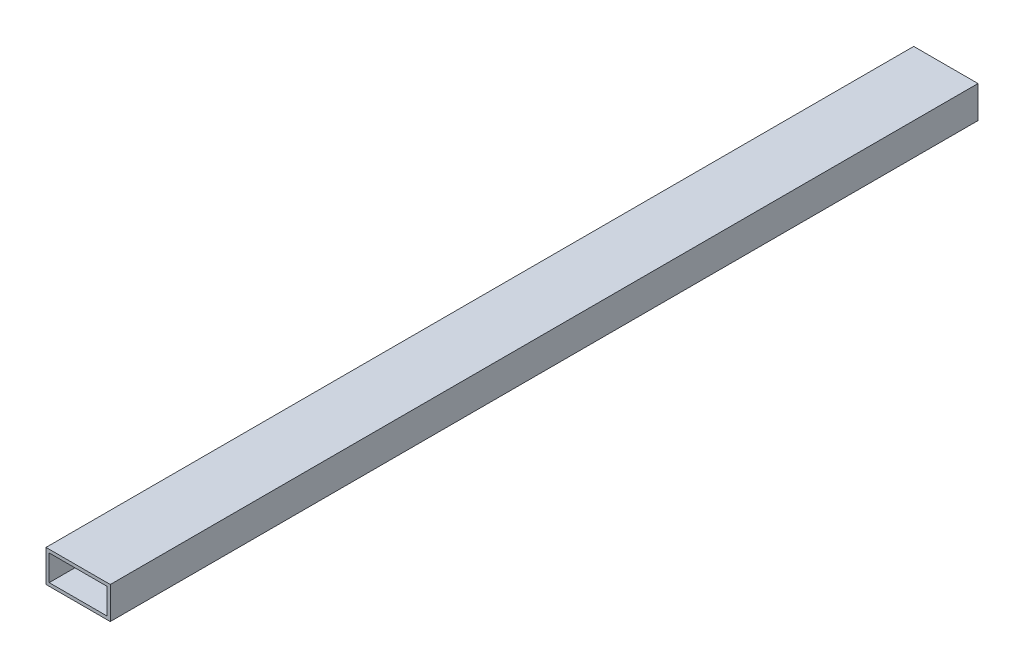
ISO-10303-21;
HEADER;
FILE_DESCRIPTION(('STEP AP214'),'2;1');
FILE_NAME('part.step','',(''),(''),'','','');
FILE_SCHEMA(('AUTOMOTIVE_DESIGN { 1 0 10303 214 1 1 1 1 }'));
ENDSEC;
DATA;
#1=APPLICATION_CONTEXT('core data for automotive mechanical design processes');
#2=APPLICATION_PROTOCOL_DEFINITION('international standard','automotive_design',2000,#1);
#3=PRODUCT_CONTEXT('',#1,'mechanical');
#4=PRODUCT('Part','Part','',(#3));
#5=PRODUCT_RELATED_PRODUCT_CATEGORY('part','',(#4));
#6=PRODUCT_DEFINITION_FORMATION('','',#4);
#7=PRODUCT_DEFINITION_CONTEXT('part definition',#1,'design');
#8=PRODUCT_DEFINITION('design','',#6,#7);
#9=PRODUCT_DEFINITION_SHAPE('','',#8);
#10=(LENGTH_UNIT() NAMED_UNIT(*) SI_UNIT(.MILLI.,.METRE.));
#11=(NAMED_UNIT(*) PLANE_ANGLE_UNIT() SI_UNIT($,.RADIAN.));
#12=(NAMED_UNIT(*) SI_UNIT($,.STERADIAN.) SOLID_ANGLE_UNIT());
#13=UNCERTAINTY_MEASURE_WITH_UNIT(LENGTH_MEASURE(1.E-05),#10,'distance_accuracy_value','');
#14=(GEOMETRIC_REPRESENTATION_CONTEXT(3) GLOBAL_UNCERTAINTY_ASSIGNED_CONTEXT((#13)) GLOBAL_UNIT_ASSIGNED_CONTEXT((#10,
#11,#12)) REPRESENTATION_CONTEXT('',''));
#15=CARTESIAN_POINT('',(0.,0.,0.));
#16=DIRECTION('',(0.,0.,1.));
#17=DIRECTION('',(1.,0.,0.));
#18=AXIS2_PLACEMENT_3D('',#15,#16,#17);
#19=CARTESIAN_POINT('',(0.,0.,270.));
#20=DIRECTION('',(0.,0.,-1.));
#21=DIRECTION('',(-1.,0.,0.));
#22=AXIS2_PLACEMENT_3D('',#19,#20,#21);
#23=PLANE('',#22);
#24=DIRECTION('',(0.,1.,0.));
#25=VECTOR('',#24,1.);
#26=CARTESIAN_POINT('',(10.,-5.,270.));
#27=LINE('',#26,#25);
#28=CARTESIAN_POINT('',(10.,-5.,270.));
#29=VERTEX_POINT('',#28);
#30=CARTESIAN_POINT('',(10.,5.,270.));
#31=VERTEX_POINT('',#30);
#32=EDGE_CURVE('E140',#29,#31,#27,.T.);
#33=ORIENTED_EDGE('',*,*,#32,.T.);
#34=DIRECTION('',(-1.,0.,0.));
#35=VECTOR('',#34,1.);
#36=CARTESIAN_POINT('',(-10.,5.,270.));
#37=LINE('',#36,#35);
#38=CARTESIAN_POINT('',(-10.,5.,270.));
#39=VERTEX_POINT('',#38);
#40=EDGE_CURVE('E143',#31,#39,#37,.T.);
#41=ORIENTED_EDGE('',*,*,#40,.T.);
#42=DIRECTION('',(0.,-1.,0.));
#43=VECTOR('',#42,1.);
#44=CARTESIAN_POINT('',(-10.,-5.,270.));
#45=LINE('',#44,#43);
#46=CARTESIAN_POINT('',(-10.,-5.,270.));
#47=VERTEX_POINT('',#46);
#48=EDGE_CURVE('E146',#39,#47,#45,.T.);
#49=ORIENTED_EDGE('',*,*,#48,.T.);
#50=DIRECTION('',(1.,0.,0.));
#51=VECTOR('',#50,1.);
#52=CARTESIAN_POINT('',(-10.,-5.,270.));
#53=LINE('',#52,#51);
#54=EDGE_CURVE('E148',#47,#29,#53,.T.);
#55=ORIENTED_EDGE('',*,*,#54,.T.);
#56=EDGE_LOOP('',(#33,#41,#49,#55));
#57=FACE_BOUND('',#56,.T.);
#58=DIRECTION('',(0.,-1.,0.));
#59=VECTOR('',#58,1.);
#60=CARTESIAN_POINT('',(-9.,-4.,270.));
#61=LINE('',#60,#59);
#62=CARTESIAN_POINT('',(-9.,4.,270.));
#63=VERTEX_POINT('',#62);
#64=CARTESIAN_POINT('',(-9.,-4.,270.));
#65=VERTEX_POINT('',#64);
#66=EDGE_CURVE('E104',#63,#65,#61,.T.);
#67=ORIENTED_EDGE('',*,*,#66,.F.);
#68=DIRECTION('',(-1.,0.,0.));
#69=VECTOR('',#68,1.);
#70=CARTESIAN_POINT('',(-9.,4.,270.));
#71=LINE('',#70,#69);
#72=CARTESIAN_POINT('',(9.,4.,270.));
#73=VERTEX_POINT('',#72);
#74=EDGE_CURVE('E126',#73,#63,#71,.T.);
#75=ORIENTED_EDGE('',*,*,#74,.F.);
#76=DIRECTION('',(0.,1.,0.));
#77=VECTOR('',#76,1.);
#78=CARTESIAN_POINT('',(9.,-4.,270.));
#79=LINE('',#78,#77);
#80=CARTESIAN_POINT('',(9.,-4.,270.));
#81=VERTEX_POINT('',#80);
#82=EDGE_CURVE('E124',#81,#73,#79,.T.);
#83=ORIENTED_EDGE('',*,*,#82,.F.);
#84=DIRECTION('',(1.,0.,0.));
#85=VECTOR('',#84,1.);
#86=CARTESIAN_POINT('',(-9.,-4.,270.));
#87=LINE('',#86,#85);
#88=EDGE_CURVE('E112',#65,#81,#87,.T.);
#89=ORIENTED_EDGE('',*,*,#88,.F.);
#90=EDGE_LOOP('',(#67,#75,#83,#89));
#91=FACE_BOUND('',#90,.T.);
#92=ADVANCED_FACE('F39',(#57,#91),#23,.F.);
#93=CARTESIAN_POINT('',(0.,0.,0.));
#94=DIRECTION('',(0.,0.,-1.));
#95=DIRECTION('',(-1.,0.,0.));
#96=AXIS2_PLACEMENT_3D('',#93,#94,#95);
#97=PLANE('',#96);
#98=DIRECTION('',(0.,1.,0.));
#99=VECTOR('',#98,1.);
#100=CARTESIAN_POINT('',(10.,-5.,0.));
#101=LINE('',#100,#99);
#102=CARTESIAN_POINT('',(10.,-5.,0.));
#103=VERTEX_POINT('',#102);
#104=CARTESIAN_POINT('',(10.,5.,0.));
#105=VERTEX_POINT('',#104);
#106=EDGE_CURVE('E120',#103,#105,#101,.T.);
#107=ORIENTED_EDGE('',*,*,#106,.F.);
#108=DIRECTION('',(1.,0.,0.));
#109=VECTOR('',#108,1.);
#110=CARTESIAN_POINT('',(-10.,-5.,0.));
#111=LINE('',#110,#109);
#112=CARTESIAN_POINT('',(-10.,-5.,0.));
#113=VERTEX_POINT('',#112);
#114=EDGE_CURVE('E144',#113,#103,#111,.T.);
#115=ORIENTED_EDGE('',*,*,#114,.F.);
#116=DIRECTION('',(0.,-1.,0.));
#117=VECTOR('',#116,1.);
#118=CARTESIAN_POINT('',(-10.,-5.,0.));
#119=LINE('',#118,#117);
#120=CARTESIAN_POINT('',(-10.,5.,0.));
#121=VERTEX_POINT('',#120);
#122=EDGE_CURVE('E155',#121,#113,#119,.T.);
#123=ORIENTED_EDGE('',*,*,#122,.F.);
#124=DIRECTION('',(-1.,0.,0.));
#125=VECTOR('',#124,1.);
#126=CARTESIAN_POINT('',(-10.,5.,0.));
#127=LINE('',#126,#125);
#128=EDGE_CURVE('E153',#105,#121,#127,.T.);
#129=ORIENTED_EDGE('',*,*,#128,.F.);
#130=EDGE_LOOP('',(#107,#115,#123,#129));
#131=FACE_BOUND('',#130,.T.);
#132=DIRECTION('',(-1.,0.,0.));
#133=VECTOR('',#132,1.);
#134=CARTESIAN_POINT('',(-9.,4.,0.));
#135=LINE('',#134,#133);
#136=CARTESIAN_POINT('',(9.,4.,0.));
#137=VERTEX_POINT('',#136);
#138=CARTESIAN_POINT('',(-9.,4.,0.));
#139=VERTEX_POINT('',#138);
#140=EDGE_CURVE('E113',#137,#139,#135,.T.);
#141=ORIENTED_EDGE('',*,*,#140,.T.);
#142=DIRECTION('',(0.,-1.,0.));
#143=VECTOR('',#142,1.);
#144=CARTESIAN_POINT('',(-9.,-4.,0.));
#145=LINE('',#144,#143);
#146=CARTESIAN_POINT('',(-9.,-4.,0.));
#147=VERTEX_POINT('',#146);
#148=EDGE_CURVE('E62',#139,#147,#145,.T.);
#149=ORIENTED_EDGE('',*,*,#148,.T.);
#150=DIRECTION('',(1.,0.,0.));
#151=VECTOR('',#150,1.);
#152=CARTESIAN_POINT('',(-9.,-4.,0.));
#153=LINE('',#152,#151);
#154=CARTESIAN_POINT('',(9.,-4.,0.));
#155=VERTEX_POINT('',#154);
#156=EDGE_CURVE('E119',#147,#155,#153,.T.);
#157=ORIENTED_EDGE('',*,*,#156,.T.);
#158=DIRECTION('',(0.,1.,0.));
#159=VECTOR('',#158,1.);
#160=CARTESIAN_POINT('',(9.,-4.,0.));
#161=LINE('',#160,#159);
#162=EDGE_CURVE('E132',#155,#137,#161,.T.);
#163=ORIENTED_EDGE('',*,*,#162,.T.);
#164=EDGE_LOOP('',(#141,#149,#157,#163));
#165=FACE_BOUND('',#164,.T.);
#166=ADVANCED_FACE('F173',(#131,#165),#97,.T.);
#167=CARTESIAN_POINT('',(10.,-5.,270.));
#168=DIRECTION('',(-1.,0.,0.));
#169=DIRECTION('',(0.,0.,1.));
#170=AXIS2_PLACEMENT_3D('',#167,#168,#169);
#171=PLANE('',#170);
#172=ORIENTED_EDGE('',*,*,#106,.T.);
#173=DIRECTION('',(0.,0.,-1.));
#174=VECTOR('',#173,1.);
#175=CARTESIAN_POINT('',(10.,5.,270.));
#176=LINE('',#175,#174);
#177=EDGE_CURVE('E11',#31,#105,#176,.T.);
#178=ORIENTED_EDGE('',*,*,#177,.F.);
#179=ORIENTED_EDGE('',*,*,#32,.F.);
#180=DIRECTION('',(0.,0.,-1.));
#181=VECTOR('',#180,1.);
#182=CARTESIAN_POINT('',(10.,-5.,270.));
#183=LINE('',#182,#181);
#184=EDGE_CURVE('E150',#29,#103,#183,.T.);
#185=ORIENTED_EDGE('',*,*,#184,.T.);
#186=EDGE_LOOP('',(#172,#178,#179,#185));
#187=FACE_BOUND('',#186,.T.);
#188=ADVANCED_FACE('F41',(#187),#171,.F.);
#189=CARTESIAN_POINT('',(-10.,5.,270.));
#190=DIRECTION('',(0.,-1.,0.));
#191=DIRECTION('',(0.,0.,-1.));
#192=AXIS2_PLACEMENT_3D('',#189,#190,#191);
#193=PLANE('',#192);
#194=ORIENTED_EDGE('',*,*,#128,.T.);
#195=DIRECTION('',(0.,0.,-1.));
#196=VECTOR('',#195,1.);
#197=CARTESIAN_POINT('',(-10.,5.,270.));
#198=LINE('',#197,#196);
#199=EDGE_CURVE('E47',#39,#121,#198,.T.);
#200=ORIENTED_EDGE('',*,*,#199,.F.);
#201=ORIENTED_EDGE('',*,*,#40,.F.);
#202=ORIENTED_EDGE('',*,*,#177,.T.);
#203=EDGE_LOOP('',(#194,#200,#201,#202));
#204=FACE_BOUND('',#203,.T.);
#205=ADVANCED_FACE('F183',(#204),#193,.F.);
#206=CARTESIAN_POINT('',(-10.,-5.,270.));
#207=DIRECTION('',(1.,0.,0.));
#208=DIRECTION('',(0.,0.,-1.));
#209=AXIS2_PLACEMENT_3D('',#206,#207,#208);
#210=PLANE('',#209);
#211=ORIENTED_EDGE('',*,*,#122,.T.);
#212=DIRECTION('',(0.,0.,-1.));
#213=VECTOR('',#212,1.);
#214=CARTESIAN_POINT('',(-10.,-5.,270.));
#215=LINE('',#214,#213);
#216=EDGE_CURVE('E160',#47,#113,#215,.T.);
#217=ORIENTED_EDGE('',*,*,#216,.F.);
#218=ORIENTED_EDGE('',*,*,#48,.F.);
#219=ORIENTED_EDGE('',*,*,#199,.T.);
#220=EDGE_LOOP('',(#211,#217,#218,#219));
#221=FACE_BOUND('',#220,.T.);
#222=ADVANCED_FACE('F167',(#221),#210,.F.);
#223=CARTESIAN_POINT('',(-10.,-5.,270.));
#224=DIRECTION('',(0.,1.,0.));
#225=DIRECTION('',(0.,0.,1.));
#226=AXIS2_PLACEMENT_3D('',#223,#224,#225);
#227=PLANE('',#226);
#228=ORIENTED_EDGE('',*,*,#114,.T.);
#229=ORIENTED_EDGE('',*,*,#184,.F.);
#230=ORIENTED_EDGE('',*,*,#54,.F.);
#231=ORIENTED_EDGE('',*,*,#216,.T.);
#232=EDGE_LOOP('',(#228,#229,#230,#231));
#233=FACE_BOUND('',#232,.T.);
#234=ADVANCED_FACE('F177',(#233),#227,.F.);
#235=CARTESIAN_POINT('',(-9.,-4.,270.));
#236=DIRECTION('',(1.,0.,0.));
#237=DIRECTION('',(0.,0.,-1.));
#238=AXIS2_PLACEMENT_3D('',#235,#236,#237);
#239=PLANE('',#238);
#240=ORIENTED_EDGE('',*,*,#148,.F.);
#241=DIRECTION('',(0.,0.,-1.));
#242=VECTOR('',#241,1.);
#243=CARTESIAN_POINT('',(-9.,4.,270.));
#244=LINE('',#243,#242);
#245=EDGE_CURVE('E108',#63,#139,#244,.T.);
#246=ORIENTED_EDGE('',*,*,#245,.F.);
#247=ORIENTED_EDGE('',*,*,#66,.T.);
#248=DIRECTION('',(0.,0.,-1.));
#249=VECTOR('',#248,1.);
#250=CARTESIAN_POINT('',(-9.,-4.,270.));
#251=LINE('',#250,#249);
#252=EDGE_CURVE('E107',#65,#147,#251,.T.);
#253=ORIENTED_EDGE('',*,*,#252,.T.);
#254=EDGE_LOOP('',(#240,#246,#247,#253));
#255=FACE_BOUND('',#254,.T.);
#256=ADVANCED_FACE('F106',(#255),#239,.T.);
#257=CARTESIAN_POINT('',(-9.,-4.,270.));
#258=DIRECTION('',(0.,1.,0.));
#259=DIRECTION('',(0.,0.,1.));
#260=AXIS2_PLACEMENT_3D('',#257,#258,#259);
#261=PLANE('',#260);
#262=ORIENTED_EDGE('',*,*,#156,.F.);
#263=ORIENTED_EDGE('',*,*,#252,.F.);
#264=ORIENTED_EDGE('',*,*,#88,.T.);
#265=DIRECTION('',(0.,0.,-1.));
#266=VECTOR('',#265,1.);
#267=CARTESIAN_POINT('',(9.,-4.,270.));
#268=LINE('',#267,#266);
#269=EDGE_CURVE('E121',#81,#155,#268,.T.);
#270=ORIENTED_EDGE('',*,*,#269,.T.);
#271=EDGE_LOOP('',(#262,#263,#264,#270));
#272=FACE_BOUND('',#271,.T.);
#273=ADVANCED_FACE('F116',(#272),#261,.T.);
#274=CARTESIAN_POINT('',(9.,-4.,270.));
#275=DIRECTION('',(-1.,0.,0.));
#276=DIRECTION('',(0.,-1.,0.));
#277=AXIS2_PLACEMENT_3D('',#274,#275,#276);
#278=PLANE('',#277);
#279=ORIENTED_EDGE('',*,*,#162,.F.);
#280=ORIENTED_EDGE('',*,*,#269,.F.);
#281=ORIENTED_EDGE('',*,*,#82,.T.);
#282=DIRECTION('',(0.,0.,-1.));
#283=VECTOR('',#282,1.);
#284=CARTESIAN_POINT('',(9.,4.,270.));
#285=LINE('',#284,#283);
#286=EDGE_CURVE('E54',#73,#137,#285,.T.);
#287=ORIENTED_EDGE('',*,*,#286,.T.);
#288=EDGE_LOOP('',(#279,#280,#281,#287));
#289=FACE_BOUND('',#288,.T.);
#290=ADVANCED_FACE('F206',(#289),#278,.T.);
#291=CARTESIAN_POINT('',(-9.,4.,270.));
#292=DIRECTION('',(0.,-1.,0.));
#293=DIRECTION('',(1.,0.,0.));
#294=AXIS2_PLACEMENT_3D('',#291,#292,#293);
#295=PLANE('',#294);
#296=ORIENTED_EDGE('',*,*,#140,.F.);
#297=ORIENTED_EDGE('',*,*,#286,.F.);
#298=ORIENTED_EDGE('',*,*,#74,.T.);
#299=ORIENTED_EDGE('',*,*,#245,.T.);
#300=EDGE_LOOP('',(#296,#297,#298,#299));
#301=FACE_BOUND('',#300,.T.);
#302=ADVANCED_FACE('F210',(#301),#295,.T.);
#303=CLOSED_SHELL('',(#92,#166,#188,#205,#222,#234,#256,#273,#290,#302));
#304=MANIFOLD_SOLID_BREP('B2',#303);
#305=ADVANCED_BREP_SHAPE_REPRESENTATION('',(#18,#304),#14);
#306=SHAPE_DEFINITION_REPRESENTATION(#9,#305);
ENDSEC;
END-ISO-10303-21;
